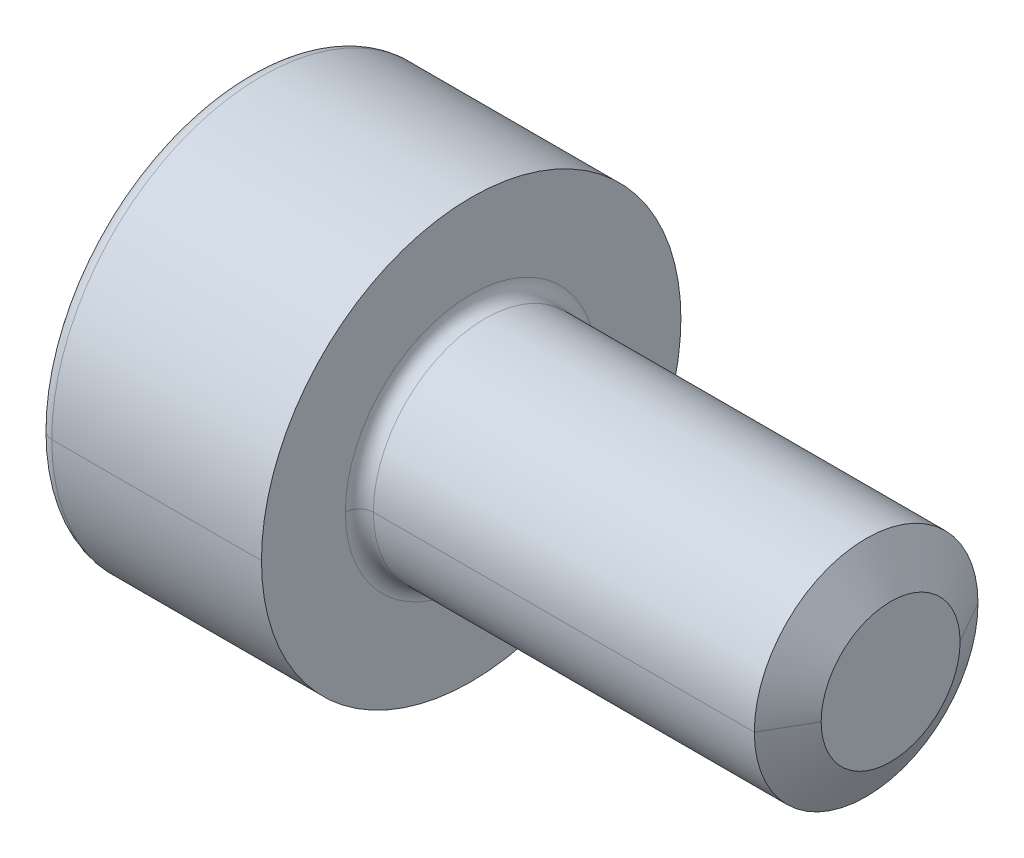
ISO-10303-21;
HEADER;
FILE_DESCRIPTION(('STEP AP214'),'2;1');
FILE_NAME('part.step','',(''),(''),'','','');
FILE_SCHEMA(('AUTOMOTIVE_DESIGN { 1 0 10303 214 1 1 1 1 }'));
ENDSEC;
DATA;
#1=APPLICATION_CONTEXT('core data for automotive mechanical design processes');
#2=APPLICATION_PROTOCOL_DEFINITION('international standard','automotive_design',2000,#1);
#3=PRODUCT_CONTEXT('',#1,'mechanical');
#4=PRODUCT('Part','Part','',(#3));
#5=PRODUCT_RELATED_PRODUCT_CATEGORY('part','',(#4));
#6=PRODUCT_DEFINITION_FORMATION('','',#4);
#7=PRODUCT_DEFINITION_CONTEXT('part definition',#1,'design');
#8=PRODUCT_DEFINITION('design','',#6,#7);
#9=PRODUCT_DEFINITION_SHAPE('','',#8);
#10=(LENGTH_UNIT() NAMED_UNIT(*) SI_UNIT(.MILLI.,.METRE.));
#11=(NAMED_UNIT(*) PLANE_ANGLE_UNIT() SI_UNIT($,.RADIAN.));
#12=(NAMED_UNIT(*) SI_UNIT($,.STERADIAN.) SOLID_ANGLE_UNIT());
#13=UNCERTAINTY_MEASURE_WITH_UNIT(LENGTH_MEASURE(1.E-05),#10,'distance_accuracy_value','');
#14=(GEOMETRIC_REPRESENTATION_CONTEXT(3) GLOBAL_UNCERTAINTY_ASSIGNED_CONTEXT((#13)) GLOBAL_UNIT_ASSIGNED_CONTEXT((#10,
#11,#12)) REPRESENTATION_CONTEXT('',''));
#15=CARTESIAN_POINT('',(0.,0.,0.));
#16=DIRECTION('',(0.,0.,1.));
#17=DIRECTION('',(1.,0.,0.));
#18=AXIS2_PLACEMENT_3D('',#15,#16,#17);
#19=CARTESIAN_POINT('',(4.6,0.8,0.));
#20=DIRECTION('',(1.,0.,0.));
#21=DIRECTION('',(0.,1.,0.));
#22=AXIS2_PLACEMENT_3D('',#19,#20,#21);
#23=PLANE('',#22);
#24=CARTESIAN_POINT('',(4.6,0.,0.));
#25=DIRECTION('',(-1.,0.,0.));
#26=DIRECTION('',(0.,0.,1.));
#27=AXIS2_PLACEMENT_3D('',#24,#25,#26);
#28=CIRCLE('',#27,0.4969);
#29=CARTESIAN_POINT('',(4.6,0.,0.4969));
#30=VERTEX_POINT('',#29);
#31=CARTESIAN_POINT('',(4.6,0.,-0.4969));
#32=VERTEX_POINT('',#31);
#33=EDGE_CURVE('E154',#30,#32,#28,.T.);
#34=ORIENTED_EDGE('',*,*,#33,.F.);
#35=CARTESIAN_POINT('',(4.6,0.,0.));
#36=DIRECTION('',(-1.,0.,0.));
#37=DIRECTION('',(0.,0.,1.));
#38=AXIS2_PLACEMENT_3D('',#35,#36,#37);
#39=CIRCLE('',#38,0.4969);
#40=EDGE_CURVE('E10',#32,#30,#39,.T.);
#41=ORIENTED_EDGE('',*,*,#40,.F.);
#42=EDGE_LOOP('',(#34,#41));
#43=FACE_BOUND('',#42,.T.);
#44=ADVANCED_FACE('F16',(#43),#23,.T.);
#45=CARTESIAN_POINT('',(4.425,0.,0.));
#46=DIRECTION('',(-1.,0.,0.));
#47=DIRECTION('',(0.,0.,1.));
#48=AXIS2_PLACEMENT_3D('',#45,#46,#47);
#49=CONICAL_SURFACE('',#48,0.8,1.04718484902493);
#50=DIRECTION('',(-0.500011000363015,0.,-0.866019052628738));
#51=VECTOR('',#50,1.);
#52=CARTESIAN_POINT('',(4.425,0.,-0.8));
#53=LINE('',#52,#51);
#54=CARTESIAN_POINT('',(4.425,0.,-0.8));
#55=VERTEX_POINT('',#54);
#56=EDGE_CURVE('E149',#32,#55,#53,.T.);
#57=ORIENTED_EDGE('',*,*,#56,.F.);
#58=ORIENTED_EDGE('',*,*,#40,.T.);
#59=DIRECTION('',(-0.500011000363015,0.,0.866019052628738));
#60=VECTOR('',#59,1.);
#61=CARTESIAN_POINT('',(4.425,0.,0.8));
#62=LINE('',#61,#60);
#63=CARTESIAN_POINT('',(4.425,0.,0.8));
#64=VERTEX_POINT('',#63);
#65=EDGE_CURVE('E148',#30,#64,#62,.T.);
#66=ORIENTED_EDGE('',*,*,#65,.T.);
#67=CARTESIAN_POINT('',(4.425,0.,0.));
#68=DIRECTION('',(-1.,0.,0.));
#69=DIRECTION('',(0.,0.,1.));
#70=AXIS2_PLACEMENT_3D('',#67,#68,#69);
#71=CIRCLE('',#70,0.8);
#72=EDGE_CURVE('E230',#55,#64,#71,.T.);
#73=ORIENTED_EDGE('',*,*,#72,.F.);
#74=EDGE_LOOP('',(#57,#58,#66,#73));
#75=FACE_BOUND('',#74,.T.);
#76=ADVANCED_FACE('F144',(#75),#49,.T.);
#77=CARTESIAN_POINT('',(0.1,0.,0.));
#78=DIRECTION('',(-1.,0.,0.));
#79=DIRECTION('',(0.,0.,1.));
#80=AXIS2_PLACEMENT_3D('',#77,#78,#79);
#81=TOROIDAL_SURFACE('',#80,1.4,0.1);
#82=CARTESIAN_POINT('',(0.1,0.,-1.4));
#83=DIRECTION('',(0.,1.,0.));
#84=DIRECTION('',(0.,0.,1.));
#85=AXIS2_PLACEMENT_3D('',#82,#83,#84);
#86=CIRCLE('',#85,0.1);
#87=CARTESIAN_POINT('',(0.1,0.,-1.5));
#88=VERTEX_POINT('',#87);
#89=CARTESIAN_POINT('',(0.,0.,-1.4));
#90=VERTEX_POINT('',#89);
#91=EDGE_CURVE('E190',#88,#90,#86,.T.);
#92=ORIENTED_EDGE('',*,*,#91,.F.);
#93=CARTESIAN_POINT('',(0.1,0.,0.));
#94=DIRECTION('',(1.,0.,0.));
#95=DIRECTION('',(0.,0.,1.));
#96=AXIS2_PLACEMENT_3D('',#93,#94,#95);
#97=CIRCLE('',#96,1.5);
#98=CARTESIAN_POINT('',(0.1,0.,1.5));
#99=VERTEX_POINT('',#98);
#100=EDGE_CURVE('E257',#99,#88,#97,.T.);
#101=ORIENTED_EDGE('',*,*,#100,.F.);
#102=CARTESIAN_POINT('',(0.1,0.,1.4));
#103=DIRECTION('',(0.,-1.,0.));
#104=DIRECTION('',(0.,0.,-1.));
#105=AXIS2_PLACEMENT_3D('',#102,#103,#104);
#106=CIRCLE('',#105,0.1);
#107=CARTESIAN_POINT('',(0.,0.,1.4));
#108=VERTEX_POINT('',#107);
#109=EDGE_CURVE('E193',#99,#108,#106,.T.);
#110=ORIENTED_EDGE('',*,*,#109,.T.);
#111=CARTESIAN_POINT('',(0.,0.,0.));
#112=DIRECTION('',(-1.,0.,0.));
#113=DIRECTION('',(0.,0.,1.));
#114=AXIS2_PLACEMENT_3D('',#111,#112,#113);
#115=CIRCLE('',#114,1.4);
#116=EDGE_CURVE('E232',#90,#108,#115,.T.);
#117=ORIENTED_EDGE('',*,*,#116,.F.);
#118=EDGE_LOOP('',(#92,#101,#110,#117));
#119=FACE_BOUND('',#118,.T.);
#120=ADVANCED_FACE('F18',(#119),#81,.T.);
#121=CARTESIAN_POINT('',(0.7,-0.4325,0.749111974273539));
#122=DIRECTION('',(-1.,0.,0.));
#123=DIRECTION('',(0.,0.,1.));
#124=AXIS2_PLACEMENT_3D('',#121,#122,#123);
#125=PLANE('',#124);
#126=DIRECTION('',(0.,0.5,0.866025403784439));
#127=VECTOR('',#126,1.);
#128=CARTESIAN_POINT('',(0.7,-0.865,0.));
#129=LINE('',#128,#127);
#130=CARTESIAN_POINT('',(0.7,-0.865,0.));
#131=VERTEX_POINT('',#130);
#132=CARTESIAN_POINT('',(0.7,-0.4325,0.749111974273539));
#133=VERTEX_POINT('',#132);
#134=EDGE_CURVE('E180',#131,#133,#129,.T.);
#135=ORIENTED_EDGE('',*,*,#134,.T.);
#136=DIRECTION('',(0.,1.,0.));
#137=VECTOR('',#136,1.);
#138=CARTESIAN_POINT('',(0.7,-0.4325,0.749111974273539));
#139=LINE('',#138,#137);
#140=CARTESIAN_POINT('',(0.7,0.4325,0.749111974273539));
#141=VERTEX_POINT('',#140);
#142=EDGE_CURVE('E20',#133,#141,#139,.T.);
#143=ORIENTED_EDGE('',*,*,#142,.T.);
#144=DIRECTION('',(0.,0.5,-0.866025403784439));
#145=VECTOR('',#144,1.);
#146=CARTESIAN_POINT('',(0.7,0.4325,0.749111974273539));
#147=LINE('',#146,#145);
#148=CARTESIAN_POINT('',(0.7,0.865,0.));
#149=VERTEX_POINT('',#148);
#150=EDGE_CURVE('E44',#141,#149,#147,.T.);
#151=ORIENTED_EDGE('',*,*,#150,.T.);
#152=DIRECTION('',(0.,-0.5,-0.866025403784439));
#153=VECTOR('',#152,1.);
#154=CARTESIAN_POINT('',(0.7,0.865,0.));
#155=LINE('',#154,#153);
#156=CARTESIAN_POINT('',(0.7,0.4325,-0.74911197427354));
#157=VERTEX_POINT('',#156);
#158=EDGE_CURVE('E285',#149,#157,#155,.T.);
#159=ORIENTED_EDGE('',*,*,#158,.T.);
#160=DIRECTION('',(0.,-1.,0.));
#161=VECTOR('',#160,1.);
#162=CARTESIAN_POINT('',(0.7,0.4325,-0.74911197427354));
#163=LINE('',#162,#161);
#164=CARTESIAN_POINT('',(0.7,-0.4325,-0.74911197427354));
#165=VERTEX_POINT('',#164);
#166=EDGE_CURVE('E276',#157,#165,#163,.T.);
#167=ORIENTED_EDGE('',*,*,#166,.T.);
#168=DIRECTION('',(0.,-0.5,0.866025403784439));
#169=VECTOR('',#168,1.);
#170=CARTESIAN_POINT('',(0.7,-0.4325,-0.74911197427354));
#171=LINE('',#170,#169);
#172=EDGE_CURVE('E272',#165,#131,#171,.T.);
#173=ORIENTED_EDGE('',*,*,#172,.T.);
#174=EDGE_LOOP('',(#135,#143,#151,#159,#167,#173));
#175=FACE_BOUND('',#174,.T.);
#176=ADVANCED_FACE('F314',(#175),#125,.T.);
#177=CARTESIAN_POINT('',(0.7,-0.4325,0.749111974273539));
#178=DIRECTION('',(0.,0.,1.));
#179=DIRECTION('',(1.,0.,0.));
#180=AXIS2_PLACEMENT_3D('',#177,#178,#179);
#181=PLANE('',#180);
#182=DIRECTION('',(0.,1.,0.));
#183=VECTOR('',#182,1.);
#184=CARTESIAN_POINT('',(0.,-0.4325,0.749111974273539));
#185=LINE('',#184,#183);
#186=CARTESIAN_POINT('',(0.,-0.4325,0.749111974273539));
#187=VERTEX_POINT('',#186);
#188=CARTESIAN_POINT('',(0.,0.4325,0.749111974273539));
#189=VERTEX_POINT('',#188);
#190=EDGE_CURVE('E258',#187,#189,#185,.T.);
#191=ORIENTED_EDGE('',*,*,#190,.T.);
#192=DIRECTION('',(-1.,0.,0.));
#193=VECTOR('',#192,1.);
#194=CARTESIAN_POINT('',(0.7,0.4325,0.749111974273539));
#195=LINE('',#194,#193);
#196=EDGE_CURVE('E293',#141,#189,#195,.T.);
#197=ORIENTED_EDGE('',*,*,#196,.F.);
#198=ORIENTED_EDGE('',*,*,#142,.F.);
#199=DIRECTION('',(-1.,0.,0.));
#200=VECTOR('',#199,1.);
#201=CARTESIAN_POINT('',(0.7,-0.4325,0.749111974273539));
#202=LINE('',#201,#200);
#203=EDGE_CURVE('E178',#133,#187,#202,.T.);
#204=ORIENTED_EDGE('',*,*,#203,.T.);
#205=EDGE_LOOP('',(#191,#197,#198,#204));
#206=FACE_BOUND('',#205,.T.);
#207=ADVANCED_FACE('F325',(#206),#181,.F.);
#208=CARTESIAN_POINT('',(0.7,0.4325,0.749111974273539));
#209=DIRECTION('',(0.,0.866025403784439,0.5));
#210=DIRECTION('',(1.,0.,0.));
#211=AXIS2_PLACEMENT_3D('',#208,#209,#210);
#212=PLANE('',#211);
#213=DIRECTION('',(0.,0.5,-0.866025403784439));
#214=VECTOR('',#213,1.);
#215=CARTESIAN_POINT('',(0.,0.4325,0.749111974273539));
#216=LINE('',#215,#214);
#217=CARTESIAN_POINT('',(0.,0.865,0.));
#218=VERTEX_POINT('',#217);
#219=EDGE_CURVE('E252',#189,#218,#216,.T.);
#220=ORIENTED_EDGE('',*,*,#219,.T.);
#221=DIRECTION('',(-1.,0.,0.));
#222=VECTOR('',#221,1.);
#223=CARTESIAN_POINT('',(0.7,0.865,0.));
#224=LINE('',#223,#222);
#225=EDGE_CURVE('E287',#149,#218,#224,.T.);
#226=ORIENTED_EDGE('',*,*,#225,.F.);
#227=ORIENTED_EDGE('',*,*,#150,.F.);
#228=ORIENTED_EDGE('',*,*,#196,.T.);
#229=EDGE_LOOP('',(#220,#226,#227,#228));
#230=FACE_BOUND('',#229,.T.);
#231=ADVANCED_FACE('F328',(#230),#212,.F.);
#232=CARTESIAN_POINT('',(0.7,0.865,0.));
#233=DIRECTION('',(0.,0.866025403784439,-0.5));
#234=DIRECTION('',(-1.,0.,0.));
#235=AXIS2_PLACEMENT_3D('',#232,#233,#234);
#236=PLANE('',#235);
#237=DIRECTION('',(0.,-0.5,-0.866025403784439));
#238=VECTOR('',#237,1.);
#239=CARTESIAN_POINT('',(0.,0.865,0.));
#240=LINE('',#239,#238);
#241=CARTESIAN_POINT('',(0.,0.4325,-0.74911197427354));
#242=VERTEX_POINT('',#241);
#243=EDGE_CURVE('E248',#218,#242,#240,.T.);
#244=ORIENTED_EDGE('',*,*,#243,.T.);
#245=DIRECTION('',(-1.,0.,0.));
#246=VECTOR('',#245,1.);
#247=CARTESIAN_POINT('',(0.7,0.4325,-0.74911197427354));
#248=LINE('',#247,#246);
#249=EDGE_CURVE('E282',#157,#242,#248,.T.);
#250=ORIENTED_EDGE('',*,*,#249,.F.);
#251=ORIENTED_EDGE('',*,*,#158,.F.);
#252=ORIENTED_EDGE('',*,*,#225,.T.);
#253=EDGE_LOOP('',(#244,#250,#251,#252));
#254=FACE_BOUND('',#253,.T.);
#255=ADVANCED_FACE('F339',(#254),#236,.F.);
#256=CARTESIAN_POINT('',(0.7,0.4325,-0.74911197427354));
#257=DIRECTION('',(0.,0.,-1.));
#258=DIRECTION('',(0.,-1.,0.));
#259=AXIS2_PLACEMENT_3D('',#256,#257,#258);
#260=PLANE('',#259);
#261=DIRECTION('',(0.,-1.,0.));
#262=VECTOR('',#261,1.);
#263=CARTESIAN_POINT('',(0.,0.4325,-0.74911197427354));
#264=LINE('',#263,#262);
#265=CARTESIAN_POINT('',(0.,-0.4325,-0.74911197427354));
#266=VERTEX_POINT('',#265);
#267=EDGE_CURVE('E243',#242,#266,#264,.T.);
#268=ORIENTED_EDGE('',*,*,#267,.T.);
#269=DIRECTION('',(-1.,0.,0.));
#270=VECTOR('',#269,1.);
#271=CARTESIAN_POINT('',(0.7,-0.4325,-0.74911197427354));
#272=LINE('',#271,#270);
#273=EDGE_CURVE('E277',#165,#266,#272,.T.);
#274=ORIENTED_EDGE('',*,*,#273,.F.);
#275=ORIENTED_EDGE('',*,*,#166,.F.);
#276=ORIENTED_EDGE('',*,*,#249,.T.);
#277=EDGE_LOOP('',(#268,#274,#275,#276));
#278=FACE_BOUND('',#277,.T.);
#279=ADVANCED_FACE('F350',(#278),#260,.F.);
#280=CARTESIAN_POINT('',(0.7,-0.4325,-0.74911197427354));
#281=DIRECTION('',(0.,-0.866025403784439,-0.5));
#282=DIRECTION('',(0.,0.5,-0.866025403784439));
#283=AXIS2_PLACEMENT_3D('',#280,#281,#282);
#284=PLANE('',#283);
#285=DIRECTION('',(0.,-0.5,0.866025403784439));
#286=VECTOR('',#285,1.);
#287=CARTESIAN_POINT('',(0.,-0.4325,-0.74911197427354));
#288=LINE('',#287,#286);
#289=CARTESIAN_POINT('',(0.,-0.865,0.));
#290=VERTEX_POINT('',#289);
#291=EDGE_CURVE('E239',#266,#290,#288,.T.);
#292=ORIENTED_EDGE('',*,*,#291,.T.);
#293=DIRECTION('',(-1.,0.,0.));
#294=VECTOR('',#293,1.);
#295=CARTESIAN_POINT('',(0.7,-0.865,0.));
#296=LINE('',#295,#294);
#297=EDGE_CURVE('E269',#131,#290,#296,.T.);
#298=ORIENTED_EDGE('',*,*,#297,.F.);
#299=ORIENTED_EDGE('',*,*,#172,.F.);
#300=ORIENTED_EDGE('',*,*,#273,.T.);
#301=EDGE_LOOP('',(#292,#298,#299,#300));
#302=FACE_BOUND('',#301,.T.);
#303=ADVANCED_FACE('F354',(#302),#284,.F.);
#304=CARTESIAN_POINT('',(0.7,-0.865,0.));
#305=DIRECTION('',(0.,-0.866025403784439,0.5));
#306=DIRECTION('',(-1.,0.,0.));
#307=AXIS2_PLACEMENT_3D('',#304,#305,#306);
#308=PLANE('',#307);
#309=DIRECTION('',(0.,0.5,0.866025403784439));
#310=VECTOR('',#309,1.);
#311=CARTESIAN_POINT('',(0.,-0.865,0.));
#312=LINE('',#311,#310);
#313=EDGE_CURVE('E240',#290,#187,#312,.T.);
#314=ORIENTED_EDGE('',*,*,#313,.T.);
#315=ORIENTED_EDGE('',*,*,#203,.F.);
#316=ORIENTED_EDGE('',*,*,#134,.F.);
#317=ORIENTED_EDGE('',*,*,#297,.T.);
#318=EDGE_LOOP('',(#314,#315,#316,#317));
#319=FACE_BOUND('',#318,.T.);
#320=ADVANCED_FACE('F366',(#319),#308,.F.);
#321=CARTESIAN_POINT('',(1.7,0.,0.));
#322=DIRECTION('',(1.,0.,0.));
#323=DIRECTION('',(0.,0.,-1.));
#324=AXIS2_PLACEMENT_3D('',#321,#322,#323);
#325=TOROIDAL_SURFACE('',#324,0.9,0.1);
#326=CARTESIAN_POINT('',(1.7,0.,0.9));
#327=DIRECTION('',(0.,1.,0.));
#328=DIRECTION('',(0.,0.,1.));
#329=AXIS2_PLACEMENT_3D('',#326,#327,#328);
#330=CIRCLE('',#329,0.1);
#331=CARTESIAN_POINT('',(1.7,0.,0.8));
#332=VERTEX_POINT('',#331);
#333=CARTESIAN_POINT('',(1.6,0.,0.9));
#334=VERTEX_POINT('',#333);
#335=EDGE_CURVE('E206',#332,#334,#330,.T.);
#336=ORIENTED_EDGE('',*,*,#335,.F.);
#337=CARTESIAN_POINT('',(1.7,0.,0.));
#338=DIRECTION('',(1.,0.,0.));
#339=DIRECTION('',(0.,0.,-1.));
#340=AXIS2_PLACEMENT_3D('',#337,#338,#339);
#341=CIRCLE('',#340,0.8);
#342=CARTESIAN_POINT('',(1.7,0.,-0.8));
#343=VERTEX_POINT('',#342);
#344=EDGE_CURVE('E168',#343,#332,#341,.T.);
#345=ORIENTED_EDGE('',*,*,#344,.F.);
#346=CARTESIAN_POINT('',(1.7,0.,-0.9));
#347=DIRECTION('',(0.,-1.,0.));
#348=DIRECTION('',(0.,0.,-1.));
#349=AXIS2_PLACEMENT_3D('',#346,#347,#348);
#350=CIRCLE('',#349,0.1);
#351=CARTESIAN_POINT('',(1.6,0.,-0.9));
#352=VERTEX_POINT('',#351);
#353=EDGE_CURVE('E202',#343,#352,#350,.T.);
#354=ORIENTED_EDGE('',*,*,#353,.T.);
#355=CARTESIAN_POINT('',(1.6,0.,0.));
#356=DIRECTION('',(1.,0.,0.));
#357=DIRECTION('',(0.,0.,-1.));
#358=AXIS2_PLACEMENT_3D('',#355,#356,#357);
#359=CIRCLE('',#358,0.9);
#360=EDGE_CURVE('E176',#352,#334,#359,.T.);
#361=ORIENTED_EDGE('',*,*,#360,.T.);
#362=EDGE_LOOP('',(#336,#345,#354,#361));
#363=FACE_BOUND('',#362,.T.);
#364=ADVANCED_FACE('F375',(#363),#325,.F.);
#365=CARTESIAN_POINT('',(1.6,1.5,0.));
#366=DIRECTION('',(1.,0.,0.));
#367=DIRECTION('',(0.,1.,0.));
#368=AXIS2_PLACEMENT_3D('',#365,#366,#367);
#369=PLANE('',#368);
#370=ORIENTED_EDGE('',*,*,#360,.F.);
#371=CARTESIAN_POINT('',(1.6,0.,0.));
#372=DIRECTION('',(1.,0.,0.));
#373=DIRECTION('',(0.,0.,-1.));
#374=AXIS2_PLACEMENT_3D('',#371,#372,#373);
#375=CIRCLE('',#374,0.9);
#376=EDGE_CURVE('E203',#334,#352,#375,.T.);
#377=ORIENTED_EDGE('',*,*,#376,.F.);
#378=EDGE_LOOP('',(#370,#377));
#379=FACE_BOUND('',#378,.T.);
#380=CARTESIAN_POINT('',(1.6,0.,0.));
#381=DIRECTION('',(1.,0.,0.));
#382=DIRECTION('',(0.,0.,-1.));
#383=AXIS2_PLACEMENT_3D('',#380,#381,#382);
#384=CIRCLE('',#383,1.5);
#385=CARTESIAN_POINT('',(1.6,0.,-1.5));
#386=VERTEX_POINT('',#385);
#387=CARTESIAN_POINT('',(1.6,0.,1.5));
#388=VERTEX_POINT('',#387);
#389=EDGE_CURVE('E182',#386,#388,#384,.T.);
#390=ORIENTED_EDGE('',*,*,#389,.T.);
#391=CARTESIAN_POINT('',(1.6,0.,0.));
#392=DIRECTION('',(1.,0.,0.));
#393=DIRECTION('',(0.,0.,-1.));
#394=AXIS2_PLACEMENT_3D('',#391,#392,#393);
#395=CIRCLE('',#394,1.5);
#396=EDGE_CURVE('E263',#388,#386,#395,.T.);
#397=ORIENTED_EDGE('',*,*,#396,.T.);
#398=EDGE_LOOP('',(#390,#397));
#399=FACE_BOUND('',#398,.T.);
#400=ADVANCED_FACE('F384',(#379,#399),#369,.T.);
#401=CARTESIAN_POINT('',(0.,0.,0.));
#402=DIRECTION('',(1.,0.,0.));
#403=DIRECTION('',(0.,0.,-1.));
#404=AXIS2_PLACEMENT_3D('',#401,#402,#403);
#405=CYLINDRICAL_SURFACE('',#404,1.5);
#406=DIRECTION('',(1.,0.,0.));
#407=VECTOR('',#406,1.);
#408=CARTESIAN_POINT('',(0.,0.,1.5));
#409=LINE('',#408,#407);
#410=EDGE_CURVE('E213',#99,#388,#409,.T.);
#411=ORIENTED_EDGE('',*,*,#410,.F.);
#412=ORIENTED_EDGE('',*,*,#100,.T.);
#413=DIRECTION('',(1.,0.,0.));
#414=VECTOR('',#413,1.);
#415=CARTESIAN_POINT('',(0.,0.,-1.5));
#416=LINE('',#415,#414);
#417=EDGE_CURVE('E175',#88,#386,#416,.T.);
#418=ORIENTED_EDGE('',*,*,#417,.T.);
#419=ORIENTED_EDGE('',*,*,#396,.F.);
#420=EDGE_LOOP('',(#411,#412,#418,#419));
#421=FACE_BOUND('',#420,.T.);
#422=ADVANCED_FACE('F386',(#421),#405,.T.);
#423=CARTESIAN_POINT('',(0.,0.,0.));
#424=DIRECTION('',(-1.,0.,0.));
#425=DIRECTION('',(0.,0.,1.));
#426=AXIS2_PLACEMENT_3D('',#423,#424,#425);
#427=PLANE('',#426);
#428=ORIENTED_EDGE('',*,*,#313,.F.);
#429=ORIENTED_EDGE('',*,*,#291,.F.);
#430=ORIENTED_EDGE('',*,*,#267,.F.);
#431=ORIENTED_EDGE('',*,*,#243,.F.);
#432=ORIENTED_EDGE('',*,*,#219,.F.);
#433=ORIENTED_EDGE('',*,*,#190,.F.);
#434=EDGE_LOOP('',(#428,#429,#430,#431,#432,#433));
#435=FACE_BOUND('',#434,.T.);
#436=CARTESIAN_POINT('',(0.,0.,0.));
#437=DIRECTION('',(-1.,0.,0.));
#438=DIRECTION('',(0.,0.,1.));
#439=AXIS2_PLACEMENT_3D('',#436,#437,#438);
#440=CIRCLE('',#439,1.4);
#441=EDGE_CURVE('E195',#108,#90,#440,.T.);
#442=ORIENTED_EDGE('',*,*,#441,.T.);
#443=ORIENTED_EDGE('',*,*,#116,.T.);
#444=EDGE_LOOP('',(#442,#443));
#445=FACE_BOUND('',#444,.T.);
#446=ADVANCED_FACE('F403',(#435,#445),#427,.T.);
#447=CARTESIAN_POINT('',(0.,0.,0.));
#448=DIRECTION('',(1.,0.,0.));
#449=DIRECTION('',(0.,0.,-1.));
#450=AXIS2_PLACEMENT_3D('',#447,#448,#449);
#451=CYLINDRICAL_SURFACE('',#450,0.8);
#452=DIRECTION('',(1.,0.,0.));
#453=VECTOR('',#452,1.);
#454=CARTESIAN_POINT('',(0.,0.,0.8));
#455=LINE('',#454,#453);
#456=EDGE_CURVE('E173',#332,#64,#455,.T.);
#457=ORIENTED_EDGE('',*,*,#456,.F.);
#458=CARTESIAN_POINT('',(1.7,0.,0.));
#459=DIRECTION('',(1.,0.,0.));
#460=DIRECTION('',(0.,0.,-1.));
#461=AXIS2_PLACEMENT_3D('',#458,#459,#460);
#462=CIRCLE('',#461,0.8);
#463=EDGE_CURVE('E197',#332,#343,#462,.T.);
#464=ORIENTED_EDGE('',*,*,#463,.T.);
#465=DIRECTION('',(1.,0.,0.));
#466=VECTOR('',#465,1.);
#467=CARTESIAN_POINT('',(0.,0.,-0.8));
#468=LINE('',#467,#466);
#469=EDGE_CURVE('E226',#343,#55,#468,.T.);
#470=ORIENTED_EDGE('',*,*,#469,.T.);
#471=ORIENTED_EDGE('',*,*,#72,.T.);
#472=EDGE_LOOP('',(#457,#464,#470,#471));
#473=FACE_BOUND('',#472,.T.);
#474=ADVANCED_FACE('F410',(#473),#451,.T.);
#475=CARTESIAN_POINT('',(0.,0.,0.));
#476=DIRECTION('',(1.,0.,0.));
#477=DIRECTION('',(0.,0.,-1.));
#478=AXIS2_PLACEMENT_3D('',#475,#476,#477);
#479=CYLINDRICAL_SURFACE('',#478,0.8);
#480=ORIENTED_EDGE('',*,*,#344,.T.);
#481=ORIENTED_EDGE('',*,*,#456,.T.);
#482=CARTESIAN_POINT('',(4.425,0.,0.));
#483=DIRECTION('',(-1.,0.,0.));
#484=DIRECTION('',(0.,0.,1.));
#485=AXIS2_PLACEMENT_3D('',#482,#483,#484);
#486=CIRCLE('',#485,0.8);
#487=EDGE_CURVE('E160',#64,#55,#486,.T.);
#488=ORIENTED_EDGE('',*,*,#487,.T.);
#489=ORIENTED_EDGE('',*,*,#469,.F.);
#490=EDGE_LOOP('',(#480,#481,#488,#489));
#491=FACE_BOUND('',#490,.T.);
#492=ADVANCED_FACE('F417',(#491),#479,.T.);
#493=CARTESIAN_POINT('',(0.,0.,0.));
#494=DIRECTION('',(1.,0.,0.));
#495=DIRECTION('',(0.,0.,-1.));
#496=AXIS2_PLACEMENT_3D('',#493,#494,#495);
#497=CYLINDRICAL_SURFACE('',#496,1.5);
#498=CARTESIAN_POINT('',(0.1,0.,0.));
#499=DIRECTION('',(1.,0.,0.));
#500=DIRECTION('',(0.,0.,1.));
#501=AXIS2_PLACEMENT_3D('',#498,#499,#500);
#502=CIRCLE('',#501,1.5);
#503=EDGE_CURVE('E157',#88,#99,#502,.T.);
#504=ORIENTED_EDGE('',*,*,#503,.T.);
#505=ORIENTED_EDGE('',*,*,#410,.T.);
#506=ORIENTED_EDGE('',*,*,#389,.F.);
#507=ORIENTED_EDGE('',*,*,#417,.F.);
#508=EDGE_LOOP('',(#504,#505,#506,#507));
#509=FACE_BOUND('',#508,.T.);
#510=ADVANCED_FACE('F430',(#509),#497,.T.);
#511=CARTESIAN_POINT('',(1.7,0.,0.));
#512=DIRECTION('',(1.,0.,0.));
#513=DIRECTION('',(0.,0.,-1.));
#514=AXIS2_PLACEMENT_3D('',#511,#512,#513);
#515=TOROIDAL_SURFACE('',#514,0.9,0.1);
#516=ORIENTED_EDGE('',*,*,#463,.F.);
#517=ORIENTED_EDGE('',*,*,#335,.T.);
#518=ORIENTED_EDGE('',*,*,#376,.T.);
#519=ORIENTED_EDGE('',*,*,#353,.F.);
#520=EDGE_LOOP('',(#516,#517,#518,#519));
#521=FACE_BOUND('',#520,.T.);
#522=ADVANCED_FACE('F443',(#521),#515,.F.);
#523=CARTESIAN_POINT('',(0.1,0.,0.));
#524=DIRECTION('',(-1.,0.,0.));
#525=DIRECTION('',(0.,0.,1.));
#526=AXIS2_PLACEMENT_3D('',#523,#524,#525);
#527=TOROIDAL_SURFACE('',#526,1.4,0.1);
#528=ORIENTED_EDGE('',*,*,#503,.F.);
#529=ORIENTED_EDGE('',*,*,#91,.T.);
#530=ORIENTED_EDGE('',*,*,#441,.F.);
#531=ORIENTED_EDGE('',*,*,#109,.F.);
#532=EDGE_LOOP('',(#528,#529,#530,#531));
#533=FACE_BOUND('',#532,.T.);
#534=ADVANCED_FACE('F455',(#533),#527,.T.);
#535=CARTESIAN_POINT('',(4.425,0.,0.));
#536=DIRECTION('',(-1.,0.,0.));
#537=DIRECTION('',(0.,0.,1.));
#538=AXIS2_PLACEMENT_3D('',#535,#536,#537);
#539=CONICAL_SURFACE('',#538,0.8,1.04718484902493);
#540=ORIENTED_EDGE('',*,*,#33,.T.);
#541=ORIENTED_EDGE('',*,*,#56,.T.);
#542=ORIENTED_EDGE('',*,*,#487,.F.);
#543=ORIENTED_EDGE('',*,*,#65,.F.);
#544=EDGE_LOOP('',(#540,#541,#542,#543));
#545=FACE_BOUND('',#544,.T.);
#546=ADVANCED_FACE('F152',(#545),#539,.T.);
#547=CLOSED_SHELL('',(#44,#76,#120,#176,#207,#231,#255,#279,#303,#320,#364,#400,#422,#446,#474,
#492,#510,#522,#534,#546));
#548=MANIFOLD_SOLID_BREP('B1',#547);
#549=ADVANCED_BREP_SHAPE_REPRESENTATION('',(#18,#548),#14);
#550=SHAPE_DEFINITION_REPRESENTATION(#9,#549);
ENDSEC;
END-ISO-10303-21;
